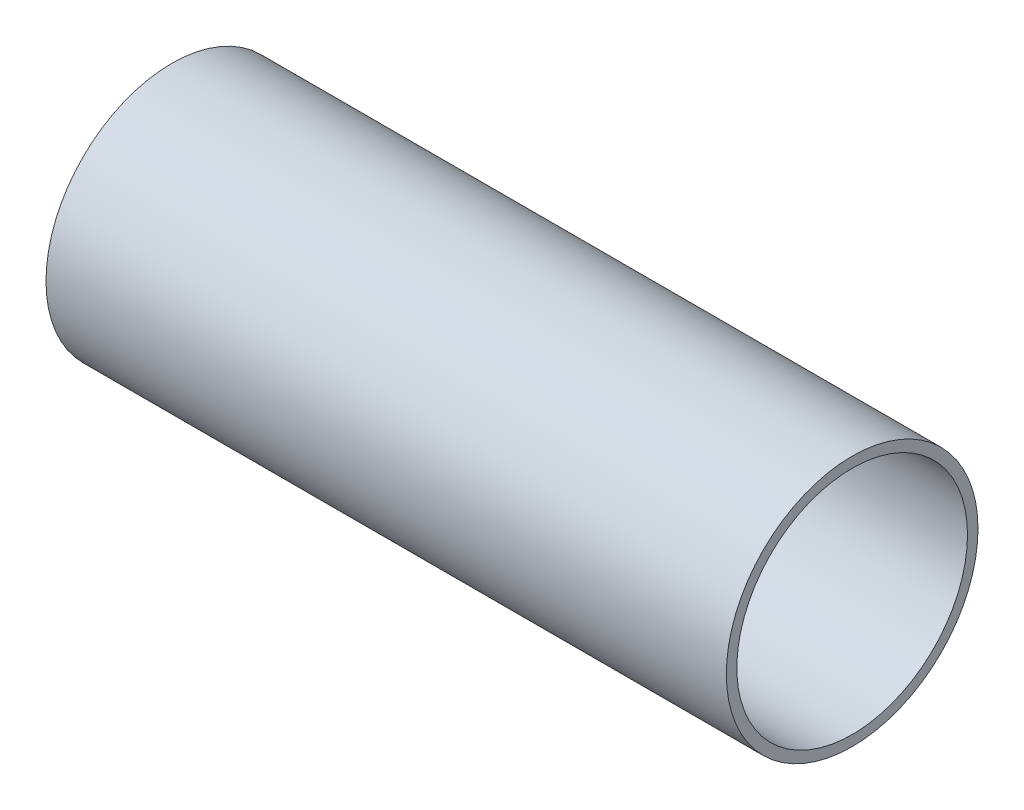
ISO-10303-21;
HEADER;
FILE_DESCRIPTION(('STEP AP214'),'2;1');
FILE_NAME('part.step','',(''),(''),'','','');
FILE_SCHEMA(('AUTOMOTIVE_DESIGN { 1 0 10303 214 1 1 1 1 }'));
ENDSEC;
DATA;
#1=APPLICATION_CONTEXT('core data for automotive mechanical design processes');
#2=APPLICATION_PROTOCOL_DEFINITION('international standard','automotive_design',2000,#1);
#3=PRODUCT_CONTEXT('',#1,'mechanical');
#4=PRODUCT('Part','Part','',(#3));
#5=PRODUCT_RELATED_PRODUCT_CATEGORY('part','',(#4));
#6=PRODUCT_DEFINITION_FORMATION('','',#4);
#7=PRODUCT_DEFINITION_CONTEXT('part definition',#1,'design');
#8=PRODUCT_DEFINITION('design','',#6,#7);
#9=PRODUCT_DEFINITION_SHAPE('','',#8);
#10=(LENGTH_UNIT() NAMED_UNIT(*) SI_UNIT(.MILLI.,.METRE.));
#11=(NAMED_UNIT(*) PLANE_ANGLE_UNIT() SI_UNIT($,.RADIAN.));
#12=(NAMED_UNIT(*) SI_UNIT($,.STERADIAN.) SOLID_ANGLE_UNIT());
#13=UNCERTAINTY_MEASURE_WITH_UNIT(LENGTH_MEASURE(1.E-05),#10,'distance_accuracy_value','');
#14=(GEOMETRIC_REPRESENTATION_CONTEXT(3) GLOBAL_UNCERTAINTY_ASSIGNED_CONTEXT((#13)) GLOBAL_UNIT_ASSIGNED_CONTEXT((#10,
#11,#12)) REPRESENTATION_CONTEXT('',''));
#15=CARTESIAN_POINT('',(0.,0.,0.));
#16=DIRECTION('',(0.,0.,1.));
#17=DIRECTION('',(1.,0.,0.));
#18=AXIS2_PLACEMENT_3D('',#15,#16,#17);
#19=CARTESIAN_POINT('',(206.,0.,0.));
#20=DIRECTION('',(1.,0.,0.));
#21=DIRECTION('',(0.,0.,-1.));
#22=AXIS2_PLACEMENT_3D('',#19,#20,#21);
#23=PLANE('',#22);
#24=CARTESIAN_POINT('',(206.,0.,0.));
#25=DIRECTION('',(1.,0.,0.));
#26=DIRECTION('',(0.,0.,-1.));
#27=AXIS2_PLACEMENT_3D('',#24,#25,#26);
#28=CIRCLE('',#27,76.2);
#29=CARTESIAN_POINT('',(206.,0.,-76.2));
#30=VERTEX_POINT('',#29);
#31=EDGE_CURVE('E10',#30,#30,#28,.T.);
#32=ORIENTED_EDGE('',*,*,#31,.T.);
#33=EDGE_LOOP('',(#32));
#34=FACE_BOUND('',#33,.T.);
#35=CARTESIAN_POINT('',(206.,0.,0.));
#36=DIRECTION('',(1.,0.,0.));
#37=DIRECTION('',(0.,0.,-1.));
#38=AXIS2_PLACEMENT_3D('',#35,#36,#37);
#39=CIRCLE('',#38,69.85);
#40=CARTESIAN_POINT('',(206.,0.,-69.85));
#41=VERTEX_POINT('',#40);
#42=EDGE_CURVE('E46',#41,#41,#39,.T.);
#43=ORIENTED_EDGE('',*,*,#42,.F.);
#44=EDGE_LOOP('',(#43));
#45=FACE_BOUND('',#44,.T.);
#46=ADVANCED_FACE('F35',(#34,#45),#23,.T.);
#47=CARTESIAN_POINT('',(-206.,0.,0.));
#48=DIRECTION('',(1.,0.,0.));
#49=DIRECTION('',(0.,0.,-1.));
#50=AXIS2_PLACEMENT_3D('',#47,#48,#49);
#51=PLANE('',#50);
#52=CARTESIAN_POINT('',(-206.,0.,0.));
#53=DIRECTION('',(1.,0.,0.));
#54=DIRECTION('',(0.,0.,-1.));
#55=AXIS2_PLACEMENT_3D('',#52,#53,#54);
#56=CIRCLE('',#55,76.2);
#57=CARTESIAN_POINT('',(-206.,0.,-76.2));
#58=VERTEX_POINT('',#57);
#59=EDGE_CURVE('E39',#58,#58,#56,.T.);
#60=ORIENTED_EDGE('',*,*,#59,.F.);
#61=EDGE_LOOP('',(#60));
#62=FACE_BOUND('',#61,.T.);
#63=CARTESIAN_POINT('',(-206.,0.,0.));
#64=DIRECTION('',(1.,0.,0.));
#65=DIRECTION('',(0.,0.,-1.));
#66=AXIS2_PLACEMENT_3D('',#63,#64,#65);
#67=CIRCLE('',#66,69.85);
#68=CARTESIAN_POINT('',(-206.,0.,-69.85));
#69=VERTEX_POINT('',#68);
#70=EDGE_CURVE('E48',#69,#69,#67,.T.);
#71=ORIENTED_EDGE('',*,*,#70,.T.);
#72=EDGE_LOOP('',(#71));
#73=FACE_BOUND('',#72,.T.);
#74=ADVANCED_FACE('F58',(#62,#73),#51,.F.);
#75=CARTESIAN_POINT('',(206.,0.,0.));
#76=DIRECTION('',(-1.,0.,0.));
#77=DIRECTION('',(0.,0.,1.));
#78=AXIS2_PLACEMENT_3D('',#75,#76,#77);
#79=CYLINDRICAL_SURFACE('',#78,76.2);
#80=ORIENTED_EDGE('',*,*,#31,.F.);
#81=EDGE_LOOP('',(#80));
#82=FACE_BOUND('',#81,.T.);
#83=ORIENTED_EDGE('',*,*,#59,.T.);
#84=EDGE_LOOP('',(#83));
#85=FACE_BOUND('',#84,.T.);
#86=ADVANCED_FACE('F37',(#82,#85),#79,.T.);
#87=CARTESIAN_POINT('',(206.,0.,0.));
#88=DIRECTION('',(-1.,0.,0.));
#89=DIRECTION('',(0.,0.,1.));
#90=AXIS2_PLACEMENT_3D('',#87,#88,#89);
#91=CYLINDRICAL_SURFACE('',#90,69.85);
#92=ORIENTED_EDGE('',*,*,#42,.T.);
#93=EDGE_LOOP('',(#92));
#94=FACE_BOUND('',#93,.T.);
#95=ORIENTED_EDGE('',*,*,#70,.F.);
#96=EDGE_LOOP('',(#95));
#97=FACE_BOUND('',#96,.T.);
#98=ADVANCED_FACE('F54',(#94,#97),#91,.F.);
#99=CLOSED_SHELL('',(#46,#74,#86,#98));
#100=MANIFOLD_SOLID_BREP('B2',#99);
#101=ADVANCED_BREP_SHAPE_REPRESENTATION('',(#18,#100),#14);
#102=SHAPE_DEFINITION_REPRESENTATION(#9,#101);
ENDSEC;
END-ISO-10303-21;
